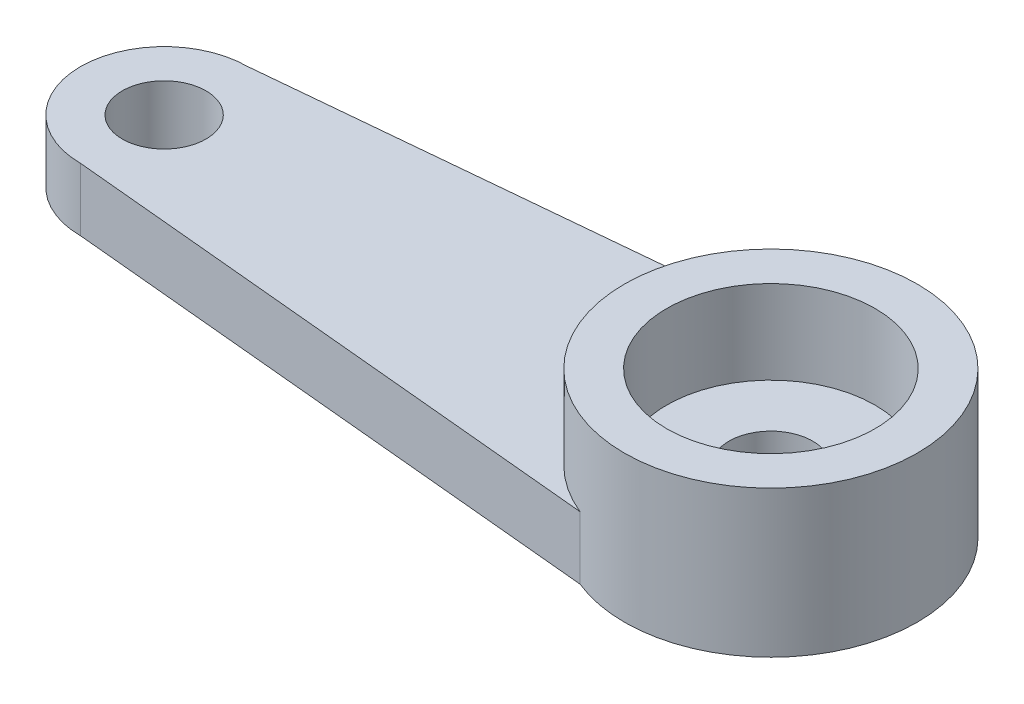
ISO-10303-21;
HEADER;
FILE_DESCRIPTION(('STEP AP214'),'2;1');
FILE_NAME('part.step','',(''),(''),'','','');
FILE_SCHEMA(('AUTOMOTIVE_DESIGN { 1 0 10303 214 1 1 1 1 }'));
ENDSEC;
DATA;
#1=APPLICATION_CONTEXT('core data for automotive mechanical design processes');
#2=APPLICATION_PROTOCOL_DEFINITION('international standard','automotive_design',2000,#1);
#3=PRODUCT_CONTEXT('',#1,'mechanical');
#4=PRODUCT('Part','Part','',(#3));
#5=PRODUCT_RELATED_PRODUCT_CATEGORY('part','',(#4));
#6=PRODUCT_DEFINITION_FORMATION('','',#4);
#7=PRODUCT_DEFINITION_CONTEXT('part definition',#1,'design');
#8=PRODUCT_DEFINITION('design','',#6,#7);
#9=PRODUCT_DEFINITION_SHAPE('','',#8);
#10=(LENGTH_UNIT() NAMED_UNIT(*) SI_UNIT(.MILLI.,.METRE.));
#11=(NAMED_UNIT(*) PLANE_ANGLE_UNIT() SI_UNIT($,.RADIAN.));
#12=(NAMED_UNIT(*) SI_UNIT($,.STERADIAN.) SOLID_ANGLE_UNIT());
#13=UNCERTAINTY_MEASURE_WITH_UNIT(LENGTH_MEASURE(1.E-05),#10,'distance_accuracy_value','');
#14=(GEOMETRIC_REPRESENTATION_CONTEXT(3) GLOBAL_UNCERTAINTY_ASSIGNED_CONTEXT((#13)) GLOBAL_UNIT_ASSIGNED_CONTEXT((#10,
#11,#12)) REPRESENTATION_CONTEXT('',''));
#15=CARTESIAN_POINT('',(0.,0.,0.));
#16=DIRECTION('',(0.,0.,1.));
#17=DIRECTION('',(1.,0.,0.));
#18=AXIS2_PLACEMENT_3D('',#15,#16,#17);
#19=CARTESIAN_POINT('',(-14.5,1.5,0.));
#20=DIRECTION('',(0.,1.,0.));
#21=DIRECTION('',(0.,0.,1.));
#22=AXIS2_PLACEMENT_3D('',#19,#20,#21);
#23=PLANE('',#22);
#24=CARTESIAN_POINT('',(0.,1.5,0.));
#25=DIRECTION('',(0.,1.,0.));
#26=DIRECTION('',(0.,0.,1.));
#27=AXIS2_PLACEMENT_3D('',#24,#25,#26);
#28=CIRCLE('',#27,1.);
#29=CARTESIAN_POINT('',(0.,1.5,1.));
#30=VERTEX_POINT('',#29);
#31=EDGE_CURVE('E124',#30,#30,#28,.T.);
#32=ORIENTED_EDGE('',*,*,#31,.F.);
#33=EDGE_LOOP('',(#32));
#34=FACE_BOUND('',#33,.T.);
#35=CARTESIAN_POINT('',(0.,1.5,0.));
#36=DIRECTION('',(0.,1.,0.));
#37=DIRECTION('',(0.,0.,1.));
#38=AXIS2_PLACEMENT_3D('',#35,#36,#37);
#39=CIRCLE('',#38,2.49041318614945);
#40=CARTESIAN_POINT('',(0.,1.5,2.49041318614945));
#41=VERTEX_POINT('',#40);
#42=EDGE_CURVE('E112',#41,#41,#39,.T.);
#43=ORIENTED_EDGE('',*,*,#42,.T.);
#44=EDGE_LOOP('',(#43));
#45=FACE_BOUND('',#44,.T.);
#46=ADVANCED_FACE('F39',(#34,#45),#23,.T.);
#47=CARTESIAN_POINT('',(0.,1.5,0.));
#48=DIRECTION('',(0.,1.,0.));
#49=DIRECTION('',(0.,0.,1.));
#50=AXIS2_PLACEMENT_3D('',#47,#48,#49);
#51=CIRCLE('',#50,3.5);
#52=CARTESIAN_POINT('',(-1.31967742517645,1.5,-3.24167418064797));
#53=VERTEX_POINT('',#52);
#54=CARTESIAN_POINT('',(-1.31967742517645,1.5,3.24167418064797));
#55=VERTEX_POINT('',#54);
#56=EDGE_CURVE('E97',#53,#55,#51,.T.);
#57=ORIENTED_EDGE('',*,*,#56,.F.);
#58=DIRECTION('',(-0.995591872161248,0.,0.0937913859928532));
#59=VECTOR('',#58,1.);
#60=CARTESIAN_POINT('',(-14.5,1.5,-2.));
#61=LINE('',#60,#59);
#62=CARTESIAN_POINT('',(-14.5,1.5,-2.));
#63=VERTEX_POINT('',#62);
#64=EDGE_CURVE('E57',#53,#63,#61,.T.);
#65=ORIENTED_EDGE('',*,*,#64,.T.);
#66=CARTESIAN_POINT('',(-14.5,1.5,0.));
#67=DIRECTION('',(0.,1.,0.));
#68=DIRECTION('',(0.,0.,1.));
#69=AXIS2_PLACEMENT_3D('',#66,#67,#68);
#70=CIRCLE('',#69,2.);
#71=CARTESIAN_POINT('',(-14.5,1.5,2.));
#72=VERTEX_POINT('',#71);
#73=EDGE_CURVE('E132',#63,#72,#70,.T.);
#74=ORIENTED_EDGE('',*,*,#73,.T.);
#75=DIRECTION('',(0.995591872161248,0.,0.0937913859928532));
#76=VECTOR('',#75,1.);
#77=CARTESIAN_POINT('',(-14.5,1.5,2.));
#78=LINE('',#77,#76);
#79=EDGE_CURVE('E86',#72,#55,#78,.T.);
#80=ORIENTED_EDGE('',*,*,#79,.T.);
#81=EDGE_LOOP('',(#57,#65,#74,#80));
#82=FACE_BOUND('',#81,.T.);
#83=CARTESIAN_POINT('',(-14.5,1.5,0.));
#84=DIRECTION('',(0.,1.,0.));
#85=DIRECTION('',(0.,0.,1.));
#86=AXIS2_PLACEMENT_3D('',#83,#84,#85);
#87=CIRCLE('',#86,1.);
#88=CARTESIAN_POINT('',(-14.5,1.5,1.));
#89=VERTEX_POINT('',#88);
#90=EDGE_CURVE('E116',#89,#89,#87,.T.);
#91=ORIENTED_EDGE('',*,*,#90,.F.);
#92=EDGE_LOOP('',(#91));
#93=FACE_BOUND('',#92,.T.);
#94=ADVANCED_FACE('F100',(#82,#93),#23,.T.);
#95=CARTESIAN_POINT('',(-14.5,0.,0.));
#96=DIRECTION('',(0.,1.,0.));
#97=DIRECTION('',(0.,0.,1.));
#98=AXIS2_PLACEMENT_3D('',#95,#96,#97);
#99=PLANE('',#98);
#100=CARTESIAN_POINT('',(-14.5,0.,0.));
#101=DIRECTION('',(0.,1.,0.));
#102=DIRECTION('',(0.,0.,1.));
#103=AXIS2_PLACEMENT_3D('',#100,#101,#102);
#104=CIRCLE('',#103,2.);
#105=CARTESIAN_POINT('',(-14.5,0.,-2.));
#106=VERTEX_POINT('',#105);
#107=CARTESIAN_POINT('',(-14.5,0.,2.));
#108=VERTEX_POINT('',#107);
#109=EDGE_CURVE('E128',#106,#108,#104,.T.);
#110=ORIENTED_EDGE('',*,*,#109,.F.);
#111=DIRECTION('',(-0.995591872161248,0.,0.0937913859928532));
#112=VECTOR('',#111,1.);
#113=CARTESIAN_POINT('',(-14.5,0.,-2.));
#114=LINE('',#113,#112);
#115=CARTESIAN_POINT('',(-1.31967742517645,0.,-3.24167418064797));
#116=VERTEX_POINT('',#115);
#117=EDGE_CURVE('E81',#116,#106,#114,.T.);
#118=ORIENTED_EDGE('',*,*,#117,.F.);
#119=CARTESIAN_POINT('',(0.,0.,0.));
#120=DIRECTION('',(0.,1.,0.));
#121=DIRECTION('',(0.,0.,1.));
#122=AXIS2_PLACEMENT_3D('',#119,#120,#121);
#123=CIRCLE('',#122,3.5);
#124=CARTESIAN_POINT('',(-1.31967742517645,0.,3.24167418064797));
#125=VERTEX_POINT('',#124);
#126=EDGE_CURVE('E76',#125,#116,#123,.T.);
#127=ORIENTED_EDGE('',*,*,#126,.F.);
#128=DIRECTION('',(0.995591872161248,0.,0.0937913859928532));
#129=VECTOR('',#128,1.);
#130=CARTESIAN_POINT('',(-14.5,0.,2.));
#131=LINE('',#130,#129);
#132=EDGE_CURVE('E140',#108,#125,#131,.T.);
#133=ORIENTED_EDGE('',*,*,#132,.F.);
#134=EDGE_LOOP('',(#110,#118,#127,#133));
#135=FACE_BOUND('',#134,.T.);
#136=CARTESIAN_POINT('',(0.,0.,0.));
#137=DIRECTION('',(0.,1.,0.));
#138=DIRECTION('',(0.,0.,1.));
#139=AXIS2_PLACEMENT_3D('',#136,#137,#138);
#140=CIRCLE('',#139,1.);
#141=CARTESIAN_POINT('',(0.,0.,1.));
#142=VERTEX_POINT('',#141);
#143=EDGE_CURVE('E120',#142,#142,#140,.T.);
#144=ORIENTED_EDGE('',*,*,#143,.T.);
#145=EDGE_LOOP('',(#144));
#146=FACE_BOUND('',#145,.T.);
#147=CARTESIAN_POINT('',(-14.5,0.,0.));
#148=DIRECTION('',(0.,1.,0.));
#149=DIRECTION('',(0.,0.,1.));
#150=AXIS2_PLACEMENT_3D('',#147,#148,#149);
#151=CIRCLE('',#150,1.);
#152=CARTESIAN_POINT('',(-14.5,0.,1.));
#153=VERTEX_POINT('',#152);
#154=EDGE_CURVE('E109',#153,#153,#151,.T.);
#155=ORIENTED_EDGE('',*,*,#154,.T.);
#156=EDGE_LOOP('',(#155));
#157=FACE_BOUND('',#156,.T.);
#158=ADVANCED_FACE('F151',(#135,#146,#157),#99,.F.);
#159=CARTESIAN_POINT('',(-14.5,1.5,0.));
#160=DIRECTION('',(0.,-1.,0.));
#161=DIRECTION('',(0.,0.,-1.));
#162=AXIS2_PLACEMENT_3D('',#159,#160,#161);
#163=CYLINDRICAL_SURFACE('',#162,2.);
#164=ORIENTED_EDGE('',*,*,#109,.T.);
#165=DIRECTION('',(0.,-1.,0.));
#166=VECTOR('',#165,1.);
#167=CARTESIAN_POINT('',(-14.5,1.5,2.));
#168=LINE('',#167,#166);
#169=EDGE_CURVE('E11',#72,#108,#168,.T.);
#170=ORIENTED_EDGE('',*,*,#169,.F.);
#171=ORIENTED_EDGE('',*,*,#73,.F.);
#172=DIRECTION('',(0.,-1.,0.));
#173=VECTOR('',#172,1.);
#174=CARTESIAN_POINT('',(-14.5,1.5,-2.));
#175=LINE('',#174,#173);
#176=EDGE_CURVE('E90',#63,#106,#175,.T.);
#177=ORIENTED_EDGE('',*,*,#176,.T.);
#178=EDGE_LOOP('',(#164,#170,#171,#177));
#179=FACE_BOUND('',#178,.T.);
#180=ADVANCED_FACE('F41',(#179),#163,.T.);
#181=CARTESIAN_POINT('',(-14.5,1.5,2.));
#182=DIRECTION('',(0.0937913859928532,0.,-0.995591872161248));
#183=DIRECTION('',(-0.995591872161249,0.,-0.0937913859928532));
#184=AXIS2_PLACEMENT_3D('',#181,#182,#183);
#185=PLANE('',#184);
#186=ORIENTED_EDGE('',*,*,#132,.T.);
#187=DIRECTION('',(0.,-1.,0.));
#188=VECTOR('',#187,1.);
#189=CARTESIAN_POINT('',(-1.31967742517645,1.5,3.24167418064797));
#190=LINE('',#189,#188);
#191=EDGE_CURVE('E49',#55,#125,#190,.T.);
#192=ORIENTED_EDGE('',*,*,#191,.F.);
#193=ORIENTED_EDGE('',*,*,#79,.F.);
#194=ORIENTED_EDGE('',*,*,#169,.T.);
#195=EDGE_LOOP('',(#186,#192,#193,#194));
#196=FACE_BOUND('',#195,.T.);
#197=ADVANCED_FACE('F155',(#196),#185,.F.);
#198=CARTESIAN_POINT('',(0.,1.5,0.));
#199=DIRECTION('',(0.,-1.,0.));
#200=DIRECTION('',(0.,0.,-1.));
#201=AXIS2_PLACEMENT_3D('',#198,#199,#200);
#202=CYLINDRICAL_SURFACE('',#201,3.5);
#203=ORIENTED_EDGE('',*,*,#126,.T.);
#204=DIRECTION('',(0.,-1.,0.));
#205=VECTOR('',#204,1.);
#206=CARTESIAN_POINT('',(-1.31967742517645,1.5,-3.24167418064797));
#207=LINE('',#206,#205);
#208=EDGE_CURVE('E89',#53,#116,#207,.T.);
#209=ORIENTED_EDGE('',*,*,#208,.F.);
#210=ORIENTED_EDGE('',*,*,#56,.T.);
#211=ORIENTED_EDGE('',*,*,#191,.T.);
#212=EDGE_LOOP('',(#203,#209,#210,#211));
#213=FACE_BOUND('',#212,.T.);
#214=CARTESIAN_POINT('',(0.,3.5,0.));
#215=DIRECTION('',(0.,1.,0.));
#216=DIRECTION('',(0.,0.,1.));
#217=AXIS2_PLACEMENT_3D('',#214,#215,#216);
#218=CIRCLE('',#217,3.5);
#219=CARTESIAN_POINT('',(0.,3.5,3.5));
#220=VERTEX_POINT('',#219);
#221=EDGE_CURVE('E103',#220,#220,#218,.T.);
#222=ORIENTED_EDGE('',*,*,#221,.F.);
#223=EDGE_LOOP('',(#222));
#224=FACE_BOUND('',#223,.T.);
#225=ADVANCED_FACE('F95',(#213,#224),#202,.T.);
#226=CARTESIAN_POINT('',(-14.5,1.5,-2.));
#227=DIRECTION('',(0.0937913859928532,0.,0.995591872161248));
#228=DIRECTION('',(0.995591872161249,0.,-0.0937913859928532));
#229=AXIS2_PLACEMENT_3D('',#226,#227,#228);
#230=PLANE('',#229);
#231=ORIENTED_EDGE('',*,*,#117,.T.);
#232=ORIENTED_EDGE('',*,*,#176,.F.);
#233=ORIENTED_EDGE('',*,*,#64,.F.);
#234=ORIENTED_EDGE('',*,*,#208,.T.);
#235=EDGE_LOOP('',(#231,#232,#233,#234));
#236=FACE_BOUND('',#235,.T.);
#237=ADVANCED_FACE('F88',(#236),#230,.F.);
#238=CARTESIAN_POINT('',(0.,1.5,0.));
#239=DIRECTION('',(0.,-1.,0.));
#240=DIRECTION('',(0.,0.,-1.));
#241=AXIS2_PLACEMENT_3D('',#238,#239,#240);
#242=CYLINDRICAL_SURFACE('',#241,1.);
#243=ORIENTED_EDGE('',*,*,#31,.T.);
#244=EDGE_LOOP('',(#243));
#245=FACE_BOUND('',#244,.T.);
#246=ORIENTED_EDGE('',*,*,#143,.F.);
#247=EDGE_LOOP('',(#246));
#248=FACE_BOUND('',#247,.T.);
#249=ADVANCED_FACE('F172',(#245,#248),#242,.F.);
#250=CARTESIAN_POINT('',(-14.5,1.5,0.));
#251=DIRECTION('',(0.,-1.,0.));
#252=DIRECTION('',(0.,0.,-1.));
#253=AXIS2_PLACEMENT_3D('',#250,#251,#252);
#254=CYLINDRICAL_SURFACE('',#253,1.);
#255=ORIENTED_EDGE('',*,*,#90,.T.);
#256=EDGE_LOOP('',(#255));
#257=FACE_BOUND('',#256,.T.);
#258=ORIENTED_EDGE('',*,*,#154,.F.);
#259=EDGE_LOOP('',(#258));
#260=FACE_BOUND('',#259,.T.);
#261=ADVANCED_FACE('F180',(#257,#260),#254,.F.);
#262=CARTESIAN_POINT('',(0.,3.5,0.));
#263=DIRECTION('',(0.,1.,0.));
#264=DIRECTION('',(0.,0.,1.));
#265=AXIS2_PLACEMENT_3D('',#262,#263,#264);
#266=PLANE('',#265);
#267=ORIENTED_EDGE('',*,*,#221,.T.);
#268=EDGE_LOOP('',(#267));
#269=FACE_BOUND('',#268,.T.);
#270=CARTESIAN_POINT('',(0.,3.5,0.));
#271=DIRECTION('',(0.,1.,0.));
#272=DIRECTION('',(0.,0.,1.));
#273=AXIS2_PLACEMENT_3D('',#270,#271,#272);
#274=CIRCLE('',#273,2.49041318614945);
#275=CARTESIAN_POINT('',(0.,3.5,2.49041318614945));
#276=VERTEX_POINT('',#275);
#277=EDGE_CURVE('E104',#276,#276,#274,.T.);
#278=ORIENTED_EDGE('',*,*,#277,.F.);
#279=EDGE_LOOP('',(#278));
#280=FACE_BOUND('',#279,.T.);
#281=ADVANCED_FACE('F185',(#269,#280),#266,.T.);
#282=CARTESIAN_POINT('',(0.,3.5,0.));
#283=DIRECTION('',(0.,-1.,0.));
#284=DIRECTION('',(0.,0.,-1.));
#285=AXIS2_PLACEMENT_3D('',#282,#283,#284);
#286=CYLINDRICAL_SURFACE('',#285,2.49041318614945);
#287=ORIENTED_EDGE('',*,*,#277,.T.);
#288=EDGE_LOOP('',(#287));
#289=FACE_BOUND('',#288,.T.);
#290=ORIENTED_EDGE('',*,*,#42,.F.);
#291=EDGE_LOOP('',(#290));
#292=FACE_BOUND('',#291,.T.);
#293=ADVANCED_FACE('F195',(#289,#292),#286,.F.);
#294=CLOSED_SHELL('',(#46,#94,#158,#180,#197,#225,#237,#249,#261,#281,#293));
#295=MANIFOLD_SOLID_BREP('B2',#294);
#296=ADVANCED_BREP_SHAPE_REPRESENTATION('',(#18,#295),#14);
#297=SHAPE_DEFINITION_REPRESENTATION(#9,#296);
ENDSEC;
END-ISO-10303-21;
